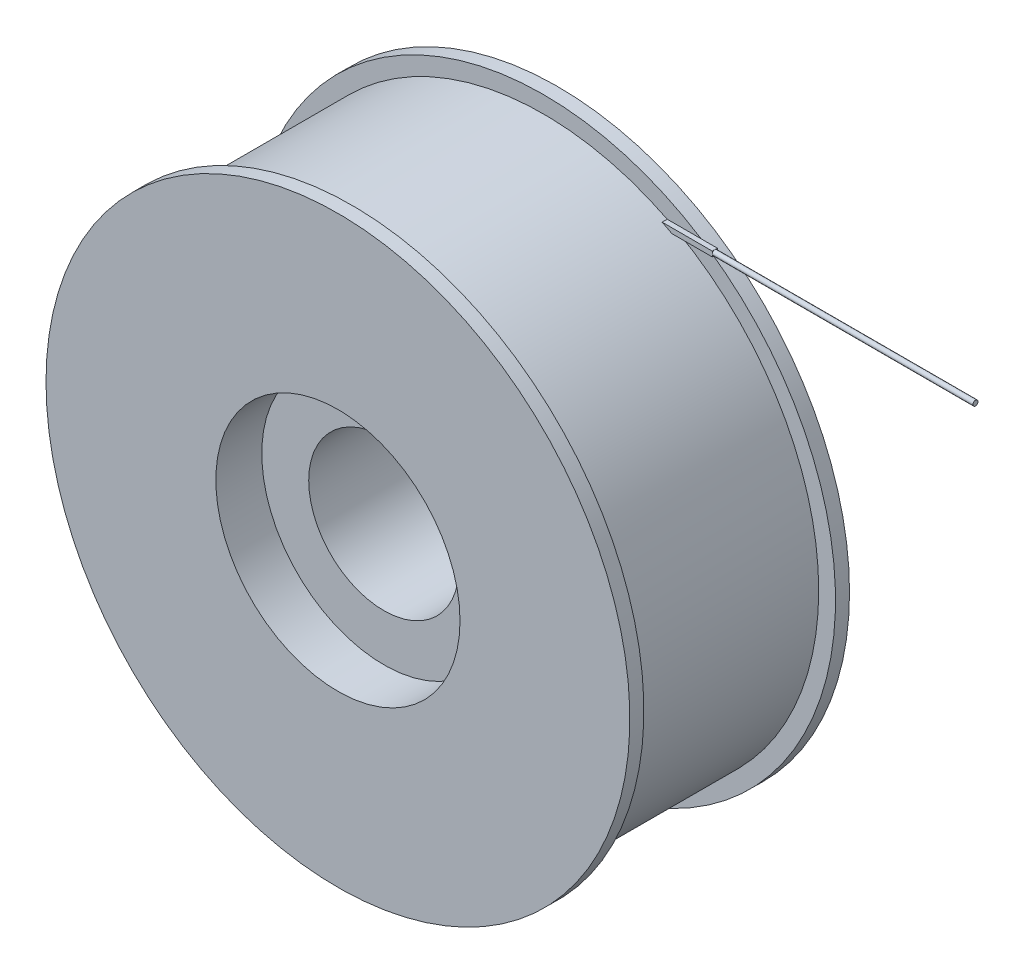
ISO-10303-21;
HEADER;
FILE_DESCRIPTION(('STEP AP214'),'2;1');
FILE_NAME('part.step','',(''),(''),'','','');
FILE_SCHEMA(('AUTOMOTIVE_DESIGN { 1 0 10303 214 1 1 1 1 }'));
ENDSEC;
DATA;
#1=APPLICATION_CONTEXT('core data for automotive mechanical design processes');
#2=APPLICATION_PROTOCOL_DEFINITION('international standard','automotive_design',2000,#1);
#3=PRODUCT_CONTEXT('',#1,'mechanical');
#4=PRODUCT('Part','Part','',(#3));
#5=PRODUCT_RELATED_PRODUCT_CATEGORY('part','',(#4));
#6=PRODUCT_DEFINITION_FORMATION('','',#4);
#7=PRODUCT_DEFINITION_CONTEXT('part definition',#1,'design');
#8=PRODUCT_DEFINITION('design','',#6,#7);
#9=PRODUCT_DEFINITION_SHAPE('','',#8);
#10=(LENGTH_UNIT() NAMED_UNIT(*) SI_UNIT(.MILLI.,.METRE.));
#11=(NAMED_UNIT(*) PLANE_ANGLE_UNIT() SI_UNIT($,.RADIAN.));
#12=(NAMED_UNIT(*) SI_UNIT($,.STERADIAN.) SOLID_ANGLE_UNIT());
#13=UNCERTAINTY_MEASURE_WITH_UNIT(LENGTH_MEASURE(1.E-05),#10,'distance_accuracy_value','');
#14=(GEOMETRIC_REPRESENTATION_CONTEXT(3) GLOBAL_UNCERTAINTY_ASSIGNED_CONTEXT((#13)) GLOBAL_UNIT_ASSIGNED_CONTEXT((#10,
#11,#12)) REPRESENTATION_CONTEXT('',''));
#15=CARTESIAN_POINT('',(0.,0.,0.));
#16=DIRECTION('',(0.,0.,1.));
#17=DIRECTION('',(1.,0.,0.));
#18=AXIS2_PLACEMENT_3D('',#15,#16,#17);
#19=CARTESIAN_POINT('',(0.,84.87,6.59));
#20=DIRECTION('',(0.,1.,0.));
#21=DIRECTION('',(0.,0.,1.));
#22=AXIS2_PLACEMENT_3D('',#19,#20,#21);
#23=PLANE('',#22);
#24=DIRECTION('',(1.,0.,0.));
#25=VECTOR('',#24,1.);
#26=CARTESIAN_POINT('',(0.,84.87,6.59));
#27=LINE('',#26,#25);
#28=CARTESIAN_POINT('',(42.6858653420544,84.87,6.58999999999998));
#29=VERTEX_POINT('',#28);
#30=CARTESIAN_POINT('',(60.,84.87,6.59));
#31=VERTEX_POINT('',#30);
#32=EDGE_CURVE('E201',#29,#31,#27,.T.);
#33=ORIENTED_EDGE('',*,*,#32,.T.);
#34=DIRECTION('',(0.,0.,-1.));
#35=VECTOR('',#34,1.);
#36=CARTESIAN_POINT('',(60.,84.87,3.64857864376269));
#37=LINE('',#36,#35);
#38=CARTESIAN_POINT('',(60.,84.87,5.715));
#39=VERTEX_POINT('',#38);
#40=EDGE_CURVE('E242',#31,#39,#37,.T.);
#41=ORIENTED_EDGE('',*,*,#40,.T.);
#42=DIRECTION('',(0.,0.,-1.));
#43=VECTOR('',#42,1.);
#44=CARTESIAN_POINT('',(60.,84.87,3.64857864376269));
#45=LINE('',#44,#43);
#46=CARTESIAN_POINT('',(60.,84.87,4.84));
#47=VERTEX_POINT('',#46);
#48=EDGE_CURVE('E236',#39,#47,#45,.T.);
#49=ORIENTED_EDGE('',*,*,#48,.T.);
#50=DIRECTION('',(1.,0.,0.));
#51=VECTOR('',#50,1.);
#52=CARTESIAN_POINT('',(0.,84.87,4.84));
#53=LINE('',#52,#51);
#54=CARTESIAN_POINT('',(54.3849528822082,84.87,4.84));
#55=VERTEX_POINT('',#54);
#56=EDGE_CURVE('E206',#55,#47,#53,.T.);
#57=ORIENTED_EDGE('',*,*,#56,.F.);
#58=CARTESIAN_POINT('',(42.6858653420544,84.87,4.84000000000001));
#59=VERTEX_POINT('',#58);
#60=EDGE_CURVE('E208',#59,#55,#53,.T.);
#61=ORIENTED_EDGE('',*,*,#60,.F.);
#62=DIRECTION('',(0.,0.,1.));
#63=VECTOR('',#62,1.);
#64=CARTESIAN_POINT('',(42.6858653420544,84.87,-263.860576850888));
#65=LINE('',#64,#63);
#66=EDGE_CURVE('E11',#29,#59,#65,.F.);
#67=ORIENTED_EDGE('',*,*,#66,.F.);
#68=EDGE_LOOP('',(#33,#41,#49,#57,#61,#67));
#69=FACE_BOUND('',#68,.T.);
#70=ADVANCED_FACE('F37',(#69),#23,.T.);
#71=CARTESIAN_POINT('',(150.,84.87,6.59));
#72=DIRECTION('',(0.,0.,1.));
#73=DIRECTION('',(1.,0.,0.));
#74=AXIS2_PLACEMENT_3D('',#71,#72,#73);
#75=PLANE('',#74);
#76=DIRECTION('',(0.,1.,0.));
#77=VECTOR('',#76,1.);
#78=CARTESIAN_POINT('',(60.,83.995,6.59));
#79=LINE('',#78,#77);
#80=CARTESIAN_POINT('',(60.,83.12,6.59));
#81=VERTEX_POINT('',#80);
#82=CARTESIAN_POINT('',(60.,83.995,6.59));
#83=VERTEX_POINT('',#82);
#84=EDGE_CURVE('E214',#81,#83,#79,.T.);
#85=ORIENTED_EDGE('',*,*,#84,.T.);
#86=DIRECTION('',(0.,1.,0.));
#87=VECTOR('',#86,1.);
#88=CARTESIAN_POINT('',(60.,83.995,6.59));
#89=LINE('',#88,#87);
#90=EDGE_CURVE('E247',#83,#31,#89,.T.);
#91=ORIENTED_EDGE('',*,*,#90,.T.);
#92=ORIENTED_EDGE('',*,*,#32,.F.);
#93=CARTESIAN_POINT('',(0.,0.,6.58999999999998));
#94=DIRECTION('',(0.,0.,1.));
#95=DIRECTION('',(1.,0.,0.));
#96=AXIS2_PLACEMENT_3D('',#93,#94,#95);
#97=CIRCLE('',#96,95.);
#98=CARTESIAN_POINT('',(46.0007130379519,83.12,6.58999999999998));
#99=VERTEX_POINT('',#98);
#100=EDGE_CURVE('E51',#99,#29,#97,.T.);
#101=ORIENTED_EDGE('',*,*,#100,.F.);
#102=DIRECTION('',(1.,0.,0.));
#103=VECTOR('',#102,1.);
#104=CARTESIAN_POINT('',(0.,83.12,6.59));
#105=LINE('',#104,#103);
#106=EDGE_CURVE('E151',#99,#81,#105,.T.);
#107=ORIENTED_EDGE('',*,*,#106,.T.);
#108=EDGE_LOOP('',(#85,#91,#92,#101,#107));
#109=FACE_BOUND('',#108,.T.);
#110=ADVANCED_FACE('F274',(#109),#75,.T.);
#111=CARTESIAN_POINT('',(150.,84.87,4.84));
#112=DIRECTION('',(0.,0.,1.));
#113=DIRECTION('',(1.,0.,0.));
#114=AXIS2_PLACEMENT_3D('',#111,#112,#113);
#115=PLANE('',#114);
#116=DIRECTION('',(0.,-1.,0.));
#117=VECTOR('',#116,1.);
#118=CARTESIAN_POINT('',(60.,83.995,4.84));
#119=LINE('',#118,#117);
#120=CARTESIAN_POINT('',(60.,83.995,4.84));
#121=VERTEX_POINT('',#120);
#122=EDGE_CURVE('E232',#47,#121,#119,.T.);
#123=ORIENTED_EDGE('',*,*,#122,.T.);
#124=DIRECTION('',(0.,-1.,0.));
#125=VECTOR('',#124,1.);
#126=CARTESIAN_POINT('',(60.,83.995,4.84));
#127=LINE('',#126,#125);
#128=CARTESIAN_POINT('',(60.,83.12,4.84));
#129=VERTEX_POINT('',#128);
#130=EDGE_CURVE('E225',#121,#129,#127,.T.);
#131=ORIENTED_EDGE('',*,*,#130,.T.);
#132=DIRECTION('',(1.,0.,0.));
#133=VECTOR('',#132,1.);
#134=CARTESIAN_POINT('',(0.,83.12,4.84));
#135=LINE('',#134,#133);
#136=CARTESIAN_POINT('',(57.0237283944149,83.12,4.84));
#137=VERTEX_POINT('',#136);
#138=EDGE_CURVE('E148',#137,#129,#135,.T.);
#139=ORIENTED_EDGE('',*,*,#138,.F.);
#140=CARTESIAN_POINT('',(0.,0.,4.84));
#141=DIRECTION('',(0.,0.,1.));
#142=DIRECTION('',(1.,0.,0.));
#143=AXIS2_PLACEMENT_3D('',#140,#141,#142);
#144=CIRCLE('',#143,100.8);
#145=EDGE_CURVE('E175',#137,#55,#144,.T.);
#146=ORIENTED_EDGE('',*,*,#145,.T.);
#147=ORIENTED_EDGE('',*,*,#56,.T.);
#148=EDGE_LOOP('',(#123,#131,#139,#146,#147));
#149=FACE_BOUND('',#148,.T.);
#150=ADVANCED_FACE('F292',(#149),#115,.F.);
#151=CARTESIAN_POINT('',(0.,83.12,6.59));
#152=DIRECTION('',(0.,1.,0.));
#153=DIRECTION('',(0.,0.,1.));
#154=AXIS2_PLACEMENT_3D('',#151,#152,#153);
#155=PLANE('',#154);
#156=DIRECTION('',(0.,0.,1.));
#157=VECTOR('',#156,1.);
#158=CARTESIAN_POINT('',(60.,83.12,3.64857864376269));
#159=LINE('',#158,#157);
#160=CARTESIAN_POINT('',(60.,83.12,5.715));
#161=VERTEX_POINT('',#160);
#162=EDGE_CURVE('E221',#129,#161,#159,.T.);
#163=ORIENTED_EDGE('',*,*,#162,.T.);
#164=DIRECTION('',(0.,0.,1.));
#165=VECTOR('',#164,1.);
#166=CARTESIAN_POINT('',(60.,83.12,3.64857864376269));
#167=LINE('',#166,#165);
#168=EDGE_CURVE('E198',#161,#81,#167,.T.);
#169=ORIENTED_EDGE('',*,*,#168,.T.);
#170=ORIENTED_EDGE('',*,*,#106,.F.);
#171=DIRECTION('',(0.,0.,1.));
#172=VECTOR('',#171,1.);
#173=CARTESIAN_POINT('',(46.0007130379519,83.12,-263.860576850888));
#174=LINE('',#173,#172);
#175=CARTESIAN_POINT('',(46.0007130379519,83.12,4.84000000000001));
#176=VERTEX_POINT('',#175);
#177=EDGE_CURVE('E45',#99,#176,#174,.F.);
#178=ORIENTED_EDGE('',*,*,#177,.T.);
#179=EDGE_CURVE('E194',#176,#137,#135,.T.);
#180=ORIENTED_EDGE('',*,*,#179,.T.);
#181=ORIENTED_EDGE('',*,*,#138,.T.);
#182=EDGE_LOOP('',(#163,#169,#170,#178,#180,#181));
#183=FACE_BOUND('',#182,.T.);
#184=ADVANCED_FACE('F192',(#183),#155,.F.);
#185=CARTESIAN_POINT('',(0.,-84.87,6.59));
#186=DIRECTION('',(0.,1.,0.));
#187=DIRECTION('',(0.,0.,1.));
#188=AXIS2_PLACEMENT_3D('',#185,#186,#187);
#189=PLANE('',#188);
#190=DIRECTION('',(1.,0.,0.));
#191=VECTOR('',#190,1.);
#192=CARTESIAN_POINT('',(0.,-84.87,4.84));
#193=LINE('',#192,#191);
#194=CARTESIAN_POINT('',(42.6858653420544,-84.87,4.84000000000001));
#195=VERTEX_POINT('',#194);
#196=CARTESIAN_POINT('',(48.8267091341374,-84.87,4.84));
#197=VERTEX_POINT('',#196);
#198=EDGE_CURVE('E135',#195,#197,#193,.T.);
#199=ORIENTED_EDGE('',*,*,#198,.T.);
#200=DIRECTION('',(0.,0.,-1.));
#201=VECTOR('',#200,1.);
#202=CARTESIAN_POINT('',(48.8267091341374,-84.87,6.58999999999999));
#203=LINE('',#202,#201);
#204=CARTESIAN_POINT('',(48.8267091341374,-84.87,6.58999999999999));
#205=VERTEX_POINT('',#204);
#206=EDGE_CURVE('E120',#205,#197,#203,.T.);
#207=ORIENTED_EDGE('',*,*,#206,.F.);
#208=DIRECTION('',(1.,0.,0.));
#209=VECTOR('',#208,1.);
#210=CARTESIAN_POINT('',(0.,-84.87,6.59));
#211=LINE('',#210,#209);
#212=CARTESIAN_POINT('',(42.6858653420544,-84.87,6.58999999999998));
#213=VERTEX_POINT('',#212);
#214=EDGE_CURVE('E132',#213,#205,#211,.T.);
#215=ORIENTED_EDGE('',*,*,#214,.F.);
#216=DIRECTION('',(0.,0.,1.));
#217=VECTOR('',#216,1.);
#218=CARTESIAN_POINT('',(42.6858653420544,-84.87,-263.860576850888));
#219=LINE('',#218,#217);
#220=EDGE_CURVE('E186',#213,#195,#219,.F.);
#221=ORIENTED_EDGE('',*,*,#220,.T.);
#222=EDGE_LOOP('',(#199,#207,#215,#221));
#223=FACE_BOUND('',#222,.T.);
#224=ADVANCED_FACE('F130',(#223),#189,.F.);
#225=CARTESIAN_POINT('',(150.,-84.87,6.59));
#226=DIRECTION('',(0.,0.,1.));
#227=DIRECTION('',(1.,0.,0.));
#228=AXIS2_PLACEMENT_3D('',#225,#226,#227);
#229=PLANE('',#228);
#230=DIRECTION('',(0.,-1.,0.));
#231=VECTOR('',#230,1.);
#232=CARTESIAN_POINT('',(48.8267091341374,18.0684246573116,6.58999999999999));
#233=LINE('',#232,#231);
#234=CARTESIAN_POINT('',(48.8267091341374,-83.12,6.58999999999999));
#235=VERTEX_POINT('',#234);
#236=EDGE_CURVE('E117',#235,#205,#233,.T.);
#237=ORIENTED_EDGE('',*,*,#236,.F.);
#238=DIRECTION('',(1.,0.,0.));
#239=VECTOR('',#238,1.);
#240=CARTESIAN_POINT('',(0.,-83.12,6.59));
#241=LINE('',#240,#239);
#242=CARTESIAN_POINT('',(46.0007130379519,-83.12,6.58999999999998));
#243=VERTEX_POINT('',#242);
#244=EDGE_CURVE('E140',#243,#235,#241,.T.);
#245=ORIENTED_EDGE('',*,*,#244,.F.);
#246=CARTESIAN_POINT('',(0.,0.,6.58999999999998));
#247=DIRECTION('',(0.,0.,1.));
#248=DIRECTION('',(1.,0.,0.));
#249=AXIS2_PLACEMENT_3D('',#246,#247,#248);
#250=CIRCLE('',#249,95.);
#251=EDGE_CURVE('E139',#213,#243,#250,.T.);
#252=ORIENTED_EDGE('',*,*,#251,.F.);
#253=ORIENTED_EDGE('',*,*,#214,.T.);
#254=EDGE_LOOP('',(#237,#245,#252,#253));
#255=FACE_BOUND('',#254,.T.);
#256=ADVANCED_FACE('F137',(#255),#229,.T.);
#257=CARTESIAN_POINT('',(0.,-83.12,6.59));
#258=DIRECTION('',(0.,1.,0.));
#259=DIRECTION('',(0.,0.,1.));
#260=AXIS2_PLACEMENT_3D('',#257,#258,#259);
#261=PLANE('',#260);
#262=DIRECTION('',(0.,0.,-1.));
#263=VECTOR('',#262,1.);
#264=CARTESIAN_POINT('',(48.8267091341374,-83.12,6.58999999999999));
#265=LINE('',#264,#263);
#266=CARTESIAN_POINT('',(48.8267091341374,-83.12,4.84));
#267=VERTEX_POINT('',#266);
#268=EDGE_CURVE('E123',#235,#267,#265,.T.);
#269=ORIENTED_EDGE('',*,*,#268,.T.);
#270=DIRECTION('',(1.,0.,0.));
#271=VECTOR('',#270,1.);
#272=CARTESIAN_POINT('',(0.,-83.12,4.84));
#273=LINE('',#272,#271);
#274=CARTESIAN_POINT('',(46.0007130379519,-83.12,4.84000000000001));
#275=VERTEX_POINT('',#274);
#276=EDGE_CURVE('E141',#275,#267,#273,.T.);
#277=ORIENTED_EDGE('',*,*,#276,.F.);
#278=DIRECTION('',(0.,0.,1.));
#279=VECTOR('',#278,1.);
#280=CARTESIAN_POINT('',(46.0007130379519,-83.12,-263.860576850888));
#281=LINE('',#280,#279);
#282=EDGE_CURVE('E183',#243,#275,#281,.F.);
#283=ORIENTED_EDGE('',*,*,#282,.F.);
#284=ORIENTED_EDGE('',*,*,#244,.T.);
#285=EDGE_LOOP('',(#269,#277,#283,#284));
#286=FACE_BOUND('',#285,.T.);
#287=ADVANCED_FACE('F257',(#286),#261,.T.);
#288=CARTESIAN_POINT('',(0.,0.,4.84));
#289=DIRECTION('',(0.,0.,1.));
#290=DIRECTION('',(1.,0.,0.));
#291=AXIS2_PLACEMENT_3D('',#288,#289,#290);
#292=PLANE('',#291);
#293=ORIENTED_EDGE('',*,*,#60,.T.);
#294=EDGE_CURVE('E172',#55,#137,#144,.T.);
#295=ORIENTED_EDGE('',*,*,#294,.T.);
#296=ORIENTED_EDGE('',*,*,#179,.F.);
#297=CARTESIAN_POINT('',(0.,0.,4.84000000000001));
#298=DIRECTION('',(0.,0.,1.));
#299=DIRECTION('',(1.,0.,0.));
#300=AXIS2_PLACEMENT_3D('',#297,#298,#299);
#301=CIRCLE('',#300,95.);
#302=EDGE_CURVE('E153',#275,#176,#301,.T.);
#303=ORIENTED_EDGE('',*,*,#302,.F.);
#304=ORIENTED_EDGE('',*,*,#276,.T.);
#305=DIRECTION('',(0.,-1.,0.));
#306=VECTOR('',#305,1.);
#307=CARTESIAN_POINT('',(48.8267091341374,18.0684246573116,4.84));
#308=LINE('',#307,#306);
#309=EDGE_CURVE('E254',#267,#197,#308,.T.);
#310=ORIENTED_EDGE('',*,*,#309,.T.);
#311=ORIENTED_EDGE('',*,*,#198,.F.);
#312=EDGE_CURVE('E143',#59,#195,#301,.T.);
#313=ORIENTED_EDGE('',*,*,#312,.F.);
#314=EDGE_LOOP('',(#293,#295,#296,#303,#304,#310,#311,#313));
#315=FACE_BOUND('',#314,.T.);
#316=ADVANCED_FACE('F261',(#315),#292,.T.);
#317=CARTESIAN_POINT('',(0.,0.,-263.860576850888));
#318=DIRECTION('',(0.,0.,1.));
#319=DIRECTION('',(1.,0.,0.));
#320=AXIS2_PLACEMENT_3D('',#317,#318,#319);
#321=CYLINDRICAL_SURFACE('',#320,95.);
#322=ORIENTED_EDGE('',*,*,#100,.T.);
#323=ORIENTED_EDGE('',*,*,#66,.T.);
#324=ORIENTED_EDGE('',*,*,#312,.T.);
#325=ORIENTED_EDGE('',*,*,#220,.F.);
#326=ORIENTED_EDGE('',*,*,#251,.T.);
#327=ORIENTED_EDGE('',*,*,#282,.T.);
#328=ORIENTED_EDGE('',*,*,#302,.T.);
#329=ORIENTED_EDGE('',*,*,#177,.F.);
#330=EDGE_LOOP('',(#322,#323,#324,#325,#326,#327,#328,#329));
#331=FACE_BOUND('',#330,.T.);
#332=CARTESIAN_POINT('',(0.,0.,71.01));
#333=DIRECTION('',(0.,0.,1.));
#334=DIRECTION('',(1.,0.,0.));
#335=AXIS2_PLACEMENT_3D('',#332,#333,#334);
#336=CIRCLE('',#335,95.);
#337=CARTESIAN_POINT('',(95.,0.,71.01));
#338=VERTEX_POINT('',#337);
#339=EDGE_CURVE('E174',#338,#338,#336,.F.);
#340=ORIENTED_EDGE('',*,*,#339,.T.);
#341=EDGE_LOOP('',(#340));
#342=FACE_BOUND('',#341,.T.);
#343=ADVANCED_FACE('F262',(#331,#342),#321,.T.);
#344=CARTESIAN_POINT('',(0.,0.,71.01));
#345=DIRECTION('',(0.,0.,1.));
#346=DIRECTION('',(1.,0.,0.));
#347=AXIS2_PLACEMENT_3D('',#344,#345,#346);
#348=PLANE('',#347);
#349=CARTESIAN_POINT('',(0.,0.,71.01));
#350=DIRECTION('',(0.,0.,1.));
#351=DIRECTION('',(1.,0.,0.));
#352=AXIS2_PLACEMENT_3D('',#349,#350,#351);
#353=CIRCLE('',#352,100.8);
#354=CARTESIAN_POINT('',(-100.8,0.,71.01));
#355=VERTEX_POINT('',#354);
#356=EDGE_CURVE('E166',#355,#355,#353,.T.);
#357=ORIENTED_EDGE('',*,*,#356,.F.);
#358=EDGE_LOOP('',(#357));
#359=FACE_BOUND('',#358,.T.);
#360=ORIENTED_EDGE('',*,*,#339,.F.);
#361=EDGE_LOOP('',(#360));
#362=FACE_BOUND('',#361,.T.);
#363=ADVANCED_FACE('F305',(#359,#362),#348,.F.);
#364=CARTESIAN_POINT('',(0.,0.,4.84));
#365=DIRECTION('',(0.,0.,-1.));
#366=DIRECTION('',(-1.,0.,0.));
#367=AXIS2_PLACEMENT_3D('',#364,#365,#366);
#368=CYLINDRICAL_SURFACE('',#367,25.95);
#369=CARTESIAN_POINT('',(0.,0.,0.));
#370=DIRECTION('',(0.,0.,1.));
#371=DIRECTION('',(1.,0.,0.));
#372=AXIS2_PLACEMENT_3D('',#369,#370,#371);
#373=CIRCLE('',#372,25.95);
#374=CARTESIAN_POINT('',(-25.95,0.,0.));
#375=VERTEX_POINT('',#374);
#376=EDGE_CURVE('E165',#375,#375,#373,.T.);
#377=CARTESIAN_POINT('',(0.,0.,59.99));
#378=DIRECTION('',(0.,0.,1.));
#379=DIRECTION('',(1.,0.,0.));
#380=AXIS2_PLACEMENT_3D('',#377,#378,#379);
#381=CIRCLE('',#380,25.95);
#382=CARTESIAN_POINT('',(-25.95,0.,59.99));
#383=VERTEX_POINT('',#382);
#384=EDGE_CURVE('E159',#383,#383,#381,.T.);
#385=CARTESIAN_POINT('',(-25.95,0.,0.));
#386=CARTESIAN_POINT('',(-25.95,0.,0.624895833333334));
#387=CARTESIAN_POINT('',(-25.95,0.,1.24979166666667));
#388=CARTESIAN_POINT('',(-25.95,0.,2.49958333333333));
#389=CARTESIAN_POINT('',(-25.95,0.,3.12447916666667));
#390=CARTESIAN_POINT('',(-25.95,0.,4.37427083333333));
#391=CARTESIAN_POINT('',(-25.95,0.,4.99916666666667));
#392=CARTESIAN_POINT('',(-25.95,0.,6.24895833333333));
#393=CARTESIAN_POINT('',(-25.95,0.,6.87385416666667));
#394=CARTESIAN_POINT('',(-25.95,0.,8.12364583333333));
#395=CARTESIAN_POINT('',(-25.95,0.,8.74854166666666));
#396=CARTESIAN_POINT('',(-25.95,0.,9.99833333333333));
#397=CARTESIAN_POINT('',(-25.95,0.,10.6232291666667));
#398=CARTESIAN_POINT('',(-25.95,0.,11.8730208333333));
#399=CARTESIAN_POINT('',(-25.95,0.,12.4979166666667));
#400=CARTESIAN_POINT('',(-25.95,0.,13.7477083333333));
#401=CARTESIAN_POINT('',(-25.95,0.,14.3726041666667));
#402=CARTESIAN_POINT('',(-25.95,0.,15.6223958333333));
#403=CARTESIAN_POINT('',(-25.95,0.,16.2472916666667));
#404=CARTESIAN_POINT('',(-25.95,0.,17.4970833333333));
#405=CARTESIAN_POINT('',(-25.95,0.,18.1219791666667));
#406=CARTESIAN_POINT('',(-25.95,0.,19.3717708333333));
#407=CARTESIAN_POINT('',(-25.95,0.,19.9966666666667));
#408=CARTESIAN_POINT('',(-25.95,0.,21.2464583333333));
#409=CARTESIAN_POINT('',(-25.95,0.,21.8713541666667));
#410=CARTESIAN_POINT('',(-25.95,0.,23.1211458333333));
#411=CARTESIAN_POINT('',(-25.95,0.,23.7460416666667));
#412=CARTESIAN_POINT('',(-25.95,0.,24.9958333333333));
#413=CARTESIAN_POINT('',(-25.95,0.,25.6207291666667));
#414=CARTESIAN_POINT('',(-25.95,0.,26.8705208333333));
#415=CARTESIAN_POINT('',(-25.95,0.,27.4954166666667));
#416=CARTESIAN_POINT('',(-25.95,0.,28.7452083333333));
#417=CARTESIAN_POINT('',(-25.95,0.,29.3701041666667));
#418=CARTESIAN_POINT('',(-25.95,0.,30.6198958333333));
#419=CARTESIAN_POINT('',(-25.95,0.,31.2447916666667));
#420=CARTESIAN_POINT('',(-25.95,0.,32.4945833333333));
#421=CARTESIAN_POINT('',(-25.95,0.,33.1194791666667));
#422=CARTESIAN_POINT('',(-25.95,0.,34.3692708333333));
#423=CARTESIAN_POINT('',(-25.95,0.,34.9941666666667));
#424=CARTESIAN_POINT('',(-25.95,0.,36.2439583333333));
#425=CARTESIAN_POINT('',(-25.95,0.,36.8688541666667));
#426=CARTESIAN_POINT('',(-25.95,0.,38.1186458333333));
#427=CARTESIAN_POINT('',(-25.95,0.,38.7435416666667));
#428=CARTESIAN_POINT('',(-25.95,0.,39.9933333333333));
#429=CARTESIAN_POINT('',(-25.95,0.,40.6182291666667));
#430=CARTESIAN_POINT('',(-25.95,0.,41.8680208333333));
#431=CARTESIAN_POINT('',(-25.95,0.,42.4929166666667));
#432=CARTESIAN_POINT('',(-25.95,0.,43.7427083333333));
#433=CARTESIAN_POINT('',(-25.95,0.,44.3676041666667));
#434=CARTESIAN_POINT('',(-25.95,0.,45.6173958333333));
#435=CARTESIAN_POINT('',(-25.95,0.,46.2422916666667));
#436=CARTESIAN_POINT('',(-25.95,0.,47.4920833333333));
#437=CARTESIAN_POINT('',(-25.95,0.,48.1169791666667));
#438=CARTESIAN_POINT('',(-25.95,0.,49.3667708333333));
#439=CARTESIAN_POINT('',(-25.95,0.,49.9916666666667));
#440=CARTESIAN_POINT('',(-25.95,0.,51.2414583333333));
#441=CARTESIAN_POINT('',(-25.95,0.,51.8663541666667));
#442=CARTESIAN_POINT('',(-25.95,0.,53.1161458333333));
#443=CARTESIAN_POINT('',(-25.95,0.,53.7410416666667));
#444=CARTESIAN_POINT('',(-25.95,0.,54.9908333333333));
#445=CARTESIAN_POINT('',(-25.95,0.,55.6157291666667));
#446=CARTESIAN_POINT('',(-25.95,0.,56.8655208333333));
#447=CARTESIAN_POINT('',(-25.95,0.,57.4904166666667));
#448=CARTESIAN_POINT('',(-25.95,0.,58.7402083333333));
#449=CARTESIAN_POINT('',(-25.95,0.,59.3651041666667));
#450=CARTESIAN_POINT('',(-25.95,0.,59.99));
#451=B_SPLINE_CURVE_WITH_KNOTS('',3,(#385,#386,#387,#388,#389,#390,#391,#392,#393,#394,#395,
#396,#397,#398,#399,#400,#401,#402,#403,#404,#405,#406,#407,#408,#409,#410,#411,#412,#413,#414,
#415,#416,#417,#418,#419,#420,#421,#422,#423,#424,#425,#426,#427,#428,#429,#430,#431,#432,#433,
#434,#435,#436,#437,#438,#439,#440,#441,#442,#443,#444,#445,#446,#447,#448,#449,#450),
.UNSPECIFIED.,.F.,.F.,(4,2,2,2,2,2,2,2,2,2,2,2,2,2,2,2,2,2,2,2,2,2,2,2,2,2,2,2,2,2,2,2,4),(0.,
1.8746875,3.749375,5.6240625,7.49875,9.3734375,11.248125,13.1228125,14.9975,16.8721875,
18.746875,20.6215625,22.49625,24.3709375,26.245625,28.1203125,29.995,31.8696875,33.744375,
35.6190625,37.49375,39.3684375,41.243125,43.1178125,44.9925,46.8671875,48.741875,50.6165625,
52.49125,54.3659375,56.240625,58.1153125,59.99),.UNSPECIFIED.);
#452=EDGE_CURVE('BSEAM322',#375,#383,#451,.T.);
#453=ORIENTED_EDGE('',*,*,#376,.F.);
#454=ORIENTED_EDGE('',*,*,#384,.T.);
#455=ORIENTED_EDGE('',*,*,#452,.T.);
#456=ORIENTED_EDGE('',*,*,#452,.F.);
#457=EDGE_LOOP('',(#453,#455,#454,#456));
#458=FACE_BOUND('',#457,.T.);
#459=ADVANCED_FACE('F322',(#458),#368,.F.);
#460=CARTESIAN_POINT('',(0.,0.,0.));
#461=DIRECTION('',(0.,0.,1.));
#462=DIRECTION('',(1.,0.,0.));
#463=AXIS2_PLACEMENT_3D('',#460,#461,#462);
#464=PLANE('',#463);
#465=CARTESIAN_POINT('',(0.,0.,0.));
#466=DIRECTION('',(0.,0.,1.));
#467=DIRECTION('',(1.,0.,0.));
#468=AXIS2_PLACEMENT_3D('',#465,#466,#467);
#469=CIRCLE('',#468,100.8);
#470=CARTESIAN_POINT('',(100.8,0.,0.));
#471=VERTEX_POINT('',#470);
#472=EDGE_CURVE('E171',#471,#471,#469,.T.);
#473=ORIENTED_EDGE('',*,*,#472,.F.);
#474=EDGE_LOOP('',(#473));
#475=FACE_BOUND('',#474,.T.);
#476=ORIENTED_EDGE('',*,*,#376,.T.);
#477=EDGE_LOOP('',(#476));
#478=FACE_BOUND('',#477,.T.);
#479=ADVANCED_FACE('F329',(#475,#478),#464,.F.);
#480=CARTESIAN_POINT('',(0.,0.,4.84));
#481=DIRECTION('',(0.,0.,-1.));
#482=DIRECTION('',(-1.,0.,0.));
#483=AXIS2_PLACEMENT_3D('',#480,#481,#482);
#484=CYLINDRICAL_SURFACE('',#483,100.8);
#485=ORIENTED_EDGE('',*,*,#294,.F.);
#486=ORIENTED_EDGE('',*,*,#145,.F.);
#487=EDGE_LOOP('',(#485,#486));
#488=FACE_BOUND('',#487,.T.);
#489=ORIENTED_EDGE('',*,*,#472,.T.);
#490=EDGE_LOOP('',(#489));
#491=FACE_BOUND('',#490,.T.);
#492=ADVANCED_FACE('F39',(#488,#491),#484,.T.);
#493=CARTESIAN_POINT('',(0.,0.,75.85));
#494=DIRECTION('',(0.,0.,1.));
#495=DIRECTION('',(1.,0.,0.));
#496=AXIS2_PLACEMENT_3D('',#493,#494,#495);
#497=PLANE('',#496);
#498=CARTESIAN_POINT('',(0.,0.,75.85));
#499=DIRECTION('',(0.,0.,1.));
#500=DIRECTION('',(1.,0.,0.));
#501=AXIS2_PLACEMENT_3D('',#498,#499,#500);
#502=CIRCLE('',#501,42.16);
#503=CARTESIAN_POINT('',(42.16,0.,75.85));
#504=VERTEX_POINT('',#503);
#505=EDGE_CURVE('E155',#504,#504,#502,.T.);
#506=ORIENTED_EDGE('',*,*,#505,.F.);
#507=EDGE_LOOP('',(#506));
#508=FACE_BOUND('',#507,.T.);
#509=CARTESIAN_POINT('',(0.,0.,75.85));
#510=DIRECTION('',(0.,0.,1.));
#511=DIRECTION('',(1.,0.,0.));
#512=AXIS2_PLACEMENT_3D('',#509,#510,#511);
#513=CIRCLE('',#512,100.8);
#514=CARTESIAN_POINT('',(-100.8,0.,75.85));
#515=VERTEX_POINT('',#514);
#516=EDGE_CURVE('E162',#515,#515,#513,.T.);
#517=ORIENTED_EDGE('',*,*,#516,.T.);
#518=EDGE_LOOP('',(#517));
#519=FACE_BOUND('',#518,.T.);
#520=ADVANCED_FACE('F316',(#508,#519),#497,.T.);
#521=CARTESIAN_POINT('',(0.,0.,75.85));
#522=DIRECTION('',(0.,0.,-1.));
#523=DIRECTION('',(-1.,0.,0.));
#524=AXIS2_PLACEMENT_3D('',#521,#522,#523);
#525=CYLINDRICAL_SURFACE('',#524,100.8);
#526=CARTESIAN_POINT('',(-100.8,0.,75.85));
#527=CARTESIAN_POINT('',(-100.8,0.,75.7995833333333));
#528=CARTESIAN_POINT('',(-100.8,0.,75.7491666666667));
#529=CARTESIAN_POINT('',(-100.8,0.,75.6483333333333));
#530=CARTESIAN_POINT('',(-100.8,0.,75.5979166666666));
#531=CARTESIAN_POINT('',(-100.8,0.,75.4970833333333));
#532=CARTESIAN_POINT('',(-100.8,0.,75.4466666666667));
#533=CARTESIAN_POINT('',(-100.8,0.,75.3458333333333));
#534=CARTESIAN_POINT('',(-100.8,0.,75.2954166666667));
#535=CARTESIAN_POINT('',(-100.8,0.,75.1945833333333));
#536=CARTESIAN_POINT('',(-100.8,0.,75.1441666666667));
#537=CARTESIAN_POINT('',(-100.8,0.,75.0433333333333));
#538=CARTESIAN_POINT('',(-100.8,0.,74.9929166666667));
#539=CARTESIAN_POINT('',(-100.8,0.,74.8920833333333));
#540=CARTESIAN_POINT('',(-100.8,0.,74.8416666666667));
#541=CARTESIAN_POINT('',(-100.8,0.,74.7408333333333));
#542=CARTESIAN_POINT('',(-100.8,0.,74.6904166666667));
#543=CARTESIAN_POINT('',(-100.8,0.,74.5895833333333));
#544=CARTESIAN_POINT('',(-100.8,0.,74.5391666666667));
#545=CARTESIAN_POINT('',(-100.8,0.,74.4383333333333));
#546=CARTESIAN_POINT('',(-100.8,0.,74.3879166666667));
#547=CARTESIAN_POINT('',(-100.8,0.,74.2870833333333));
#548=CARTESIAN_POINT('',(-100.8,0.,74.2366666666667));
#549=CARTESIAN_POINT('',(-100.8,0.,74.1358333333333));
#550=CARTESIAN_POINT('',(-100.8,0.,74.0854166666667));
#551=CARTESIAN_POINT('',(-100.8,0.,73.9845833333333));
#552=CARTESIAN_POINT('',(-100.8,0.,73.9341666666667));
#553=CARTESIAN_POINT('',(-100.8,0.,73.8333333333333));
#554=CARTESIAN_POINT('',(-100.8,0.,73.7829166666667));
#555=CARTESIAN_POINT('',(-100.8,0.,73.6820833333333));
#556=CARTESIAN_POINT('',(-100.8,0.,73.6316666666667));
#557=CARTESIAN_POINT('',(-100.8,0.,73.5308333333333));
#558=CARTESIAN_POINT('',(-100.8,0.,73.4804166666667));
#559=CARTESIAN_POINT('',(-100.8,0.,73.3795833333333));
#560=CARTESIAN_POINT('',(-100.8,0.,73.3291666666667));
#561=CARTESIAN_POINT('',(-100.8,0.,73.2283333333333));
#562=CARTESIAN_POINT('',(-100.8,0.,73.1779166666667));
#563=CARTESIAN_POINT('',(-100.8,0.,73.0770833333333));
#564=CARTESIAN_POINT('',(-100.8,0.,73.0266666666667));
#565=CARTESIAN_POINT('',(-100.8,0.,72.9258333333333));
#566=CARTESIAN_POINT('',(-100.8,0.,72.8754166666667));
#567=CARTESIAN_POINT('',(-100.8,0.,72.7745833333333));
#568=CARTESIAN_POINT('',(-100.8,0.,72.7241666666667));
#569=CARTESIAN_POINT('',(-100.8,0.,72.6233333333333));
#570=CARTESIAN_POINT('',(-100.8,0.,72.5729166666667));
#571=CARTESIAN_POINT('',(-100.8,0.,72.4720833333333));
#572=CARTESIAN_POINT('',(-100.8,0.,72.4216666666667));
#573=CARTESIAN_POINT('',(-100.8,0.,72.3208333333333));
#574=CARTESIAN_POINT('',(-100.8,0.,72.2704166666667));
#575=CARTESIAN_POINT('',(-100.8,0.,72.1695833333333));
#576=CARTESIAN_POINT('',(-100.8,0.,72.1191666666667));
#577=CARTESIAN_POINT('',(-100.8,0.,72.0183333333333));
#578=CARTESIAN_POINT('',(-100.8,0.,71.9679166666667));
#579=CARTESIAN_POINT('',(-100.8,0.,71.8670833333333));
#580=CARTESIAN_POINT('',(-100.8,0.,71.8166666666667));
#581=CARTESIAN_POINT('',(-100.8,0.,71.7158333333333));
#582=CARTESIAN_POINT('',(-100.8,0.,71.6654166666667));
#583=CARTESIAN_POINT('',(-100.8,0.,71.5645833333333));
#584=CARTESIAN_POINT('',(-100.8,0.,71.5141666666667));
#585=CARTESIAN_POINT('',(-100.8,0.,71.4133333333333));
#586=CARTESIAN_POINT('',(-100.8,0.,71.3629166666667));
#587=CARTESIAN_POINT('',(-100.8,0.,71.2620833333333));
#588=CARTESIAN_POINT('',(-100.8,0.,71.2116666666667));
#589=CARTESIAN_POINT('',(-100.8,0.,71.1108333333333));
#590=CARTESIAN_POINT('',(-100.8,0.,71.0604166666667));
#591=CARTESIAN_POINT('',(-100.8,0.,71.01));
#592=B_SPLINE_CURVE_WITH_KNOTS('',3,(#526,#527,#528,#529,#530,#531,#532,#533,#534,#535,#536,
#537,#538,#539,#540,#541,#542,#543,#544,#545,#546,#547,#548,#549,#550,#551,#552,#553,#554,#555,
#556,#557,#558,#559,#560,#561,#562,#563,#564,#565,#566,#567,#568,#569,#570,#571,#572,#573,#574,
#575,#576,#577,#578,#579,#580,#581,#582,#583,#584,#585,#586,#587,#588,#589,#590,#591),
.UNSPECIFIED.,.F.,.F.,(4,2,2,2,2,2,2,2,2,2,2,2,2,2,2,2,2,2,2,2,2,2,2,2,2,2,2,2,2,2,2,2,4),(0.,
0.151250000000006,0.302500000000011,0.453750000000003,0.605000000000008,0.75625,
0.907500000000006,1.05875000000001,1.21,1.36125000000001,1.5125,1.66375000000001,
1.81500000000001,1.96625,2.11750000000001,2.26875,2.42000000000001,2.57125000000001,2.7225,
2.87375000000001,3.025,3.17625000000001,3.32750000000001,3.47875,3.63000000000001,3.78125,
3.93250000000001,4.08375,4.235,4.38625000000001,4.5375,4.68875000000001,4.84),.UNSPECIFIED.);
#593=EDGE_CURVE('BSEAM314',#515,#355,#592,.T.);
#594=ORIENTED_EDGE('',*,*,#516,.F.);
#595=ORIENTED_EDGE('',*,*,#356,.T.);
#596=ORIENTED_EDGE('',*,*,#593,.T.);
#597=ORIENTED_EDGE('',*,*,#593,.F.);
#598=EDGE_LOOP('',(#594,#596,#595,#597));
#599=FACE_BOUND('',#598,.T.);
#600=ADVANCED_FACE('F314',(#599),#525,.T.);
#601=CARTESIAN_POINT('',(0.,0.,59.99));
#602=DIRECTION('',(0.,0.,1.));
#603=DIRECTION('',(1.,0.,0.));
#604=AXIS2_PLACEMENT_3D('',#601,#602,#603);
#605=CYLINDRICAL_SURFACE('',#604,42.16);
#606=CARTESIAN_POINT('',(0.,0.,59.99));
#607=DIRECTION('',(0.,0.,1.));
#608=DIRECTION('',(1.,0.,0.));
#609=AXIS2_PLACEMENT_3D('',#606,#607,#608);
#610=CIRCLE('',#609,42.16);
#611=CARTESIAN_POINT('',(42.16,0.,59.99));
#612=VERTEX_POINT('',#611);
#613=EDGE_CURVE('E156',#612,#612,#610,.T.);
#614=ORIENTED_EDGE('',*,*,#613,.F.);
#615=EDGE_LOOP('',(#614));
#616=FACE_BOUND('',#615,.T.);
#617=ORIENTED_EDGE('',*,*,#505,.T.);
#618=EDGE_LOOP('',(#617));
#619=FACE_BOUND('',#618,.T.);
#620=ADVANCED_FACE('F310',(#616,#619),#605,.F.);
#621=CARTESIAN_POINT('',(0.,0.,59.99));
#622=DIRECTION('',(0.,0.,1.));
#623=DIRECTION('',(1.,0.,0.));
#624=AXIS2_PLACEMENT_3D('',#621,#622,#623);
#625=PLANE('',#624);
#626=ORIENTED_EDGE('',*,*,#384,.F.);
#627=EDGE_LOOP('',(#626));
#628=FACE_BOUND('',#627,.T.);
#629=ORIENTED_EDGE('',*,*,#613,.T.);
#630=EDGE_LOOP('',(#629));
#631=FACE_BOUND('',#630,.T.);
#632=ADVANCED_FACE('F306',(#628,#631),#625,.T.);
#633=CARTESIAN_POINT('',(150.,84.87,6.59));
#634=DIRECTION('',(1.,0.,0.));
#635=DIRECTION('',(0.,0.,-1.));
#636=AXIS2_PLACEMENT_3D('',#633,#634,#635);
#637=PLANE('',#636);
#638=CARTESIAN_POINT('',(150.,83.995,5.715));
#639=DIRECTION('',(-1.,0.,0.));
#640=DIRECTION('',(0.,0.,-1.));
#641=AXIS2_PLACEMENT_3D('',#638,#639,#640);
#642=CIRCLE('',#641,0.875);
#643=CARTESIAN_POINT('',(150.,83.995,4.84));
#644=VERTEX_POINT('',#643);
#645=EDGE_CURVE('E219',#644,#644,#642,.T.);
#646=ORIENTED_EDGE('',*,*,#645,.F.);
#647=EDGE_LOOP('',(#646));
#648=FACE_BOUND('',#647,.T.);
#649=ADVANCED_FACE('F309',(#648),#637,.T.);
#650=CARTESIAN_POINT('',(60.,83.995,5.715));
#651=DIRECTION('',(1.,0.,0.));
#652=DIRECTION('',(0.,0.,-1.));
#653=AXIS2_PLACEMENT_3D('',#650,#651,#652);
#654=CYLINDRICAL_SURFACE('',#653,0.875);
#655=ORIENTED_EDGE('',*,*,#645,.T.);
#656=EDGE_LOOP('',(#655));
#657=FACE_BOUND('',#656,.T.);
#658=CARTESIAN_POINT('',(60.,83.995,5.715));
#659=DIRECTION('',(-1.,0.,0.));
#660=DIRECTION('',(0.,0.,-1.));
#661=AXIS2_PLACEMENT_3D('',#658,#659,#660);
#662=CIRCLE('',#661,0.875);
#663=EDGE_CURVE('E251',#83,#39,#662,.T.);
#664=ORIENTED_EDGE('',*,*,#663,.F.);
#665=CARTESIAN_POINT('',(60.,83.995,5.715));
#666=DIRECTION('',(-1.,0.,0.));
#667=DIRECTION('',(0.,0.,-1.));
#668=AXIS2_PLACEMENT_3D('',#665,#666,#667);
#669=CIRCLE('',#668,0.875);
#670=EDGE_CURVE('E216',#161,#83,#669,.T.);
#671=ORIENTED_EDGE('',*,*,#670,.F.);
#672=CARTESIAN_POINT('',(60.,83.995,5.715));
#673=DIRECTION('',(-1.,0.,0.));
#674=DIRECTION('',(0.,0.,-1.));
#675=AXIS2_PLACEMENT_3D('',#672,#673,#674);
#676=CIRCLE('',#675,0.875);
#677=EDGE_CURVE('E228',#121,#161,#676,.T.);
#678=ORIENTED_EDGE('',*,*,#677,.F.);
#679=CARTESIAN_POINT('',(60.,83.995,5.715));
#680=DIRECTION('',(-1.,0.,0.));
#681=DIRECTION('',(0.,0.,-1.));
#682=AXIS2_PLACEMENT_3D('',#679,#680,#681);
#683=CIRCLE('',#682,0.875);
#684=EDGE_CURVE('E239',#39,#121,#683,.T.);
#685=ORIENTED_EDGE('',*,*,#684,.F.);
#686=EDGE_LOOP('',(#664,#671,#678,#685));
#687=FACE_BOUND('',#686,.T.);
#688=ADVANCED_FACE('F270',(#657,#687),#654,.T.);
#689=CARTESIAN_POINT('',(60.,83.995,3.64857864376269));
#690=DIRECTION('',(1.,0.,0.));
#691=DIRECTION('',(0.,0.,-1.));
#692=AXIS2_PLACEMENT_3D('',#689,#690,#691);
#693=PLANE('',#692);
#694=ORIENTED_EDGE('',*,*,#670,.T.);
#695=ORIENTED_EDGE('',*,*,#84,.F.);
#696=ORIENTED_EDGE('',*,*,#168,.F.);
#697=EDGE_LOOP('',(#694,#695,#696));
#698=FACE_BOUND('',#697,.T.);
#699=ADVANCED_FACE('F273',(#698),#693,.T.);
#700=CARTESIAN_POINT('',(60.,83.995,3.64857864376269));
#701=DIRECTION('',(1.,0.,0.));
#702=DIRECTION('',(0.,0.,-1.));
#703=AXIS2_PLACEMENT_3D('',#700,#701,#702);
#704=PLANE('',#703);
#705=ORIENTED_EDGE('',*,*,#677,.T.);
#706=ORIENTED_EDGE('',*,*,#162,.F.);
#707=ORIENTED_EDGE('',*,*,#130,.F.);
#708=EDGE_LOOP('',(#705,#706,#707));
#709=FACE_BOUND('',#708,.T.);
#710=ADVANCED_FACE('F284',(#709),#704,.T.);
#711=CARTESIAN_POINT('',(60.,83.995,3.64857864376269));
#712=DIRECTION('',(1.,0.,0.));
#713=DIRECTION('',(0.,0.,-1.));
#714=AXIS2_PLACEMENT_3D('',#711,#712,#713);
#715=PLANE('',#714);
#716=ORIENTED_EDGE('',*,*,#684,.T.);
#717=ORIENTED_EDGE('',*,*,#122,.F.);
#718=ORIENTED_EDGE('',*,*,#48,.F.);
#719=EDGE_LOOP('',(#716,#717,#718));
#720=FACE_BOUND('',#719,.T.);
#721=ADVANCED_FACE('F267',(#720),#715,.T.);
#722=CARTESIAN_POINT('',(60.,83.995,3.64857864376269));
#723=DIRECTION('',(1.,0.,0.));
#724=DIRECTION('',(0.,0.,-1.));
#725=AXIS2_PLACEMENT_3D('',#722,#723,#724);
#726=PLANE('',#725);
#727=ORIENTED_EDGE('',*,*,#663,.T.);
#728=ORIENTED_EDGE('',*,*,#40,.F.);
#729=ORIENTED_EDGE('',*,*,#90,.F.);
#730=EDGE_LOOP('',(#727,#728,#729));
#731=FACE_BOUND('',#730,.T.);
#732=ADVANCED_FACE('F276',(#731),#726,.T.);
#733=CARTESIAN_POINT('',(48.8267091341374,18.0684246573116,6.58999999999999));
#734=DIRECTION('',(-1.,0.,0.));
#735=DIRECTION('',(0.,0.,1.));
#736=AXIS2_PLACEMENT_3D('',#733,#734,#735);
#737=PLANE('',#736);
#738=ORIENTED_EDGE('',*,*,#236,.T.);
#739=ORIENTED_EDGE('',*,*,#206,.T.);
#740=ORIENTED_EDGE('',*,*,#309,.F.);
#741=ORIENTED_EDGE('',*,*,#268,.F.);
#742=EDGE_LOOP('',(#738,#739,#740,#741));
#743=FACE_BOUND('',#742,.T.);
#744=ADVANCED_FACE('F119',(#743),#737,.F.);
#745=CLOSED_SHELL('',(#70,#110,#150,#184,#224,#256,#287,#316,#343,#363,#459,#479,#492,#520,#600,
#620,#632,#649,#688,#699,#710,#721,#732,#744));
#746=MANIFOLD_SOLID_BREP('B2',#745);
#747=ADVANCED_BREP_SHAPE_REPRESENTATION('',(#18,#746),#14);
#748=SHAPE_DEFINITION_REPRESENTATION(#9,#747);
ENDSEC;
END-ISO-10303-21;
